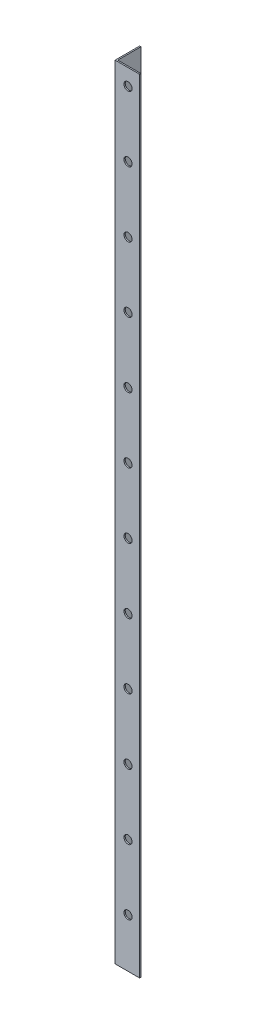
ISO-10303-21;
HEADER;
FILE_DESCRIPTION(('STEP AP214'),'2;1');
FILE_NAME('part.step','',(''),(''),'','','');
FILE_SCHEMA(('AUTOMOTIVE_DESIGN { 1 0 10303 214 1 1 1 1 }'));
ENDSEC;
DATA;
#1=APPLICATION_CONTEXT('core data for automotive mechanical design processes');
#2=APPLICATION_PROTOCOL_DEFINITION('international standard','automotive_design',2000,#1);
#3=PRODUCT_CONTEXT('',#1,'mechanical');
#4=PRODUCT('Part','Part','',(#3));
#5=PRODUCT_RELATED_PRODUCT_CATEGORY('part','',(#4));
#6=PRODUCT_DEFINITION_FORMATION('','',#4);
#7=PRODUCT_DEFINITION_CONTEXT('part definition',#1,'design');
#8=PRODUCT_DEFINITION('design','',#6,#7);
#9=PRODUCT_DEFINITION_SHAPE('','',#8);
#10=(LENGTH_UNIT() NAMED_UNIT(*) SI_UNIT(.MILLI.,.METRE.));
#11=(NAMED_UNIT(*) PLANE_ANGLE_UNIT() SI_UNIT($,.RADIAN.));
#12=(NAMED_UNIT(*) SI_UNIT($,.STERADIAN.) SOLID_ANGLE_UNIT());
#13=UNCERTAINTY_MEASURE_WITH_UNIT(LENGTH_MEASURE(1.E-05),#10,'distance_accuracy_value','');
#14=(GEOMETRIC_REPRESENTATION_CONTEXT(3) GLOBAL_UNCERTAINTY_ASSIGNED_CONTEXT((#13)) GLOBAL_UNIT_ASSIGNED_CONTEXT((#10,
#11,#12)) REPRESENTATION_CONTEXT('',''));
#15=CARTESIAN_POINT('',(0.,0.,0.));
#16=DIRECTION('',(0.,0.,1.));
#17=DIRECTION('',(1.,0.,0.));
#18=AXIS2_PLACEMENT_3D('',#15,#16,#17);
#19=CARTESIAN_POINT('',(0.,6.35000000000002,-5.0165));
#20=DIRECTION('',(1.,0.,0.));
#21=DIRECTION('',(0.,0.,-1.));
#22=AXIS2_PLACEMENT_3D('',#19,#20,#21);
#23=CYLINDRICAL_SURFACE('',#22,1.5875);
#24=CARTESIAN_POINT('',(0.,6.35000000000002,-5.0165));
#25=DIRECTION('',(1.,0.,0.));
#26=DIRECTION('',(0.,0.,-1.));
#27=AXIS2_PLACEMENT_3D('',#24,#25,#26);
#28=CIRCLE('',#27,1.5875);
#29=CARTESIAN_POINT('',(0.,6.35000000000002,-6.604));
#30=VERTEX_POINT('',#29);
#31=EDGE_CURVE('E50',#30,#30,#28,.T.);
#32=ORIENTED_EDGE('',*,*,#31,.F.);
#33=EDGE_LOOP('',(#32));
#34=FACE_BOUND('',#33,.T.);
#35=CARTESIAN_POINT('',(0.508,6.35000000000002,-5.0165));
#36=DIRECTION('',(1.,0.,0.));
#37=DIRECTION('',(0.,0.,-1.));
#38=AXIS2_PLACEMENT_3D('',#35,#36,#37);
#39=CIRCLE('',#38,1.5875);
#40=CARTESIAN_POINT('',(0.508,6.35000000000002,-6.604));
#41=VERTEX_POINT('',#40);
#42=EDGE_CURVE('E11',#41,#41,#39,.T.);
#43=ORIENTED_EDGE('',*,*,#42,.T.);
#44=EDGE_LOOP('',(#43));
#45=FACE_BOUND('',#44,.T.);
#46=ADVANCED_FACE('F39',(#34,#45),#23,.F.);
#47=CARTESIAN_POINT('',(0.,31.75,-5.0165));
#48=DIRECTION('',(1.,0.,0.));
#49=DIRECTION('',(0.,0.,-1.));
#50=AXIS2_PLACEMENT_3D('',#47,#48,#49);
#51=CYLINDRICAL_SURFACE('',#50,1.5875);
#52=CARTESIAN_POINT('',(0.,31.75,-5.0165));
#53=DIRECTION('',(1.,0.,0.));
#54=DIRECTION('',(0.,0.,-1.));
#55=AXIS2_PLACEMENT_3D('',#52,#53,#54);
#56=CIRCLE('',#55,1.5875);
#57=CARTESIAN_POINT('',(0.,31.75,-6.604));
#58=VERTEX_POINT('',#57);
#59=EDGE_CURVE('E255',#58,#58,#56,.T.);
#60=ORIENTED_EDGE('',*,*,#59,.F.);
#61=EDGE_LOOP('',(#60));
#62=FACE_BOUND('',#61,.T.);
#63=CARTESIAN_POINT('',(0.508,31.75,-5.0165));
#64=DIRECTION('',(1.,0.,0.));
#65=DIRECTION('',(0.,0.,-1.));
#66=AXIS2_PLACEMENT_3D('',#63,#64,#65);
#67=CIRCLE('',#66,1.5875);
#68=CARTESIAN_POINT('',(0.508,31.75,-6.604));
#69=VERTEX_POINT('',#68);
#70=EDGE_CURVE('E260',#69,#69,#67,.T.);
#71=ORIENTED_EDGE('',*,*,#70,.T.);
#72=EDGE_LOOP('',(#71));
#73=FACE_BOUND('',#72,.T.);
#74=ADVANCED_FACE('F266',(#62,#73),#51,.F.);
#75=CARTESIAN_POINT('',(0.,57.15,-5.0165));
#76=DIRECTION('',(1.,0.,0.));
#77=DIRECTION('',(0.,0.,-1.));
#78=AXIS2_PLACEMENT_3D('',#75,#76,#77);
#79=CYLINDRICAL_SURFACE('',#78,1.5875);
#80=CARTESIAN_POINT('',(0.,57.15,-5.0165));
#81=DIRECTION('',(1.,0.,0.));
#82=DIRECTION('',(0.,0.,-1.));
#83=AXIS2_PLACEMENT_3D('',#80,#81,#82);
#84=CIRCLE('',#83,1.5875);
#85=CARTESIAN_POINT('',(0.,57.15,-6.604));
#86=VERTEX_POINT('',#85);
#87=EDGE_CURVE('E249',#86,#86,#84,.T.);
#88=ORIENTED_EDGE('',*,*,#87,.F.);
#89=EDGE_LOOP('',(#88));
#90=FACE_BOUND('',#89,.T.);
#91=CARTESIAN_POINT('',(0.508,57.15,-5.0165));
#92=DIRECTION('',(1.,0.,0.));
#93=DIRECTION('',(0.,0.,-1.));
#94=AXIS2_PLACEMENT_3D('',#91,#92,#93);
#95=CIRCLE('',#94,1.5875);
#96=CARTESIAN_POINT('',(0.508,57.15,-6.604));
#97=VERTEX_POINT('',#96);
#98=EDGE_CURVE('E253',#97,#97,#95,.T.);
#99=ORIENTED_EDGE('',*,*,#98,.T.);
#100=EDGE_LOOP('',(#99));
#101=FACE_BOUND('',#100,.T.);
#102=ADVANCED_FACE('F361',(#90,#101),#79,.F.);
#103=CARTESIAN_POINT('',(0.,82.55,-5.0165));
#104=DIRECTION('',(1.,0.,0.));
#105=DIRECTION('',(0.,0.,-1.));
#106=AXIS2_PLACEMENT_3D('',#103,#104,#105);
#107=CYLINDRICAL_SURFACE('',#106,1.5875);
#108=CARTESIAN_POINT('',(0.,82.55,-5.0165));
#109=DIRECTION('',(1.,0.,0.));
#110=DIRECTION('',(0.,0.,-1.));
#111=AXIS2_PLACEMENT_3D('',#108,#109,#110);
#112=CIRCLE('',#111,1.5875);
#113=CARTESIAN_POINT('',(0.,82.55,-6.604));
#114=VERTEX_POINT('',#113);
#115=EDGE_CURVE('E245',#114,#114,#112,.T.);
#116=ORIENTED_EDGE('',*,*,#115,.F.);
#117=EDGE_LOOP('',(#116));
#118=FACE_BOUND('',#117,.T.);
#119=CARTESIAN_POINT('',(0.508,82.55,-5.0165));
#120=DIRECTION('',(1.,0.,0.));
#121=DIRECTION('',(0.,0.,-1.));
#122=AXIS2_PLACEMENT_3D('',#119,#120,#121);
#123=CIRCLE('',#122,1.5875);
#124=CARTESIAN_POINT('',(0.508,82.55,-6.604));
#125=VERTEX_POINT('',#124);
#126=EDGE_CURVE('E243',#125,#125,#123,.T.);
#127=ORIENTED_EDGE('',*,*,#126,.T.);
#128=EDGE_LOOP('',(#127));
#129=FACE_BOUND('',#128,.T.);
#130=ADVANCED_FACE('F358',(#118,#129),#107,.F.);
#131=CARTESIAN_POINT('',(0.,107.95,-5.0165));
#132=DIRECTION('',(1.,0.,0.));
#133=DIRECTION('',(0.,0.,-1.));
#134=AXIS2_PLACEMENT_3D('',#131,#132,#133);
#135=CYLINDRICAL_SURFACE('',#134,1.5875);
#136=CARTESIAN_POINT('',(0.,107.95,-5.0165));
#137=DIRECTION('',(1.,0.,0.));
#138=DIRECTION('',(0.,0.,-1.));
#139=AXIS2_PLACEMENT_3D('',#136,#137,#138);
#140=CIRCLE('',#139,1.5875);
#141=CARTESIAN_POINT('',(0.,107.95,-6.604));
#142=VERTEX_POINT('',#141);
#143=EDGE_CURVE('E237',#142,#142,#140,.T.);
#144=ORIENTED_EDGE('',*,*,#143,.F.);
#145=EDGE_LOOP('',(#144));
#146=FACE_BOUND('',#145,.T.);
#147=CARTESIAN_POINT('',(0.508,107.95,-5.0165));
#148=DIRECTION('',(1.,0.,0.));
#149=DIRECTION('',(0.,0.,-1.));
#150=AXIS2_PLACEMENT_3D('',#147,#148,#149);
#151=CIRCLE('',#150,1.5875);
#152=CARTESIAN_POINT('',(0.508,107.95,-6.604));
#153=VERTEX_POINT('',#152);
#154=EDGE_CURVE('E239',#153,#153,#151,.T.);
#155=ORIENTED_EDGE('',*,*,#154,.T.);
#156=EDGE_LOOP('',(#155));
#157=FACE_BOUND('',#156,.T.);
#158=ADVANCED_FACE('F353',(#146,#157),#135,.F.);
#159=CARTESIAN_POINT('',(0.,133.35,-5.0165));
#160=DIRECTION('',(1.,0.,0.));
#161=DIRECTION('',(0.,0.,-1.));
#162=AXIS2_PLACEMENT_3D('',#159,#160,#161);
#163=CYLINDRICAL_SURFACE('',#162,1.5875);
#164=CARTESIAN_POINT('',(0.,133.35,-5.0165));
#165=DIRECTION('',(1.,0.,0.));
#166=DIRECTION('',(0.,0.,-1.));
#167=AXIS2_PLACEMENT_3D('',#164,#165,#166);
#168=CIRCLE('',#167,1.5875);
#169=CARTESIAN_POINT('',(0.,133.35,-6.604));
#170=VERTEX_POINT('',#169);
#171=EDGE_CURVE('E228',#170,#170,#168,.T.);
#172=ORIENTED_EDGE('',*,*,#171,.F.);
#173=EDGE_LOOP('',(#172));
#174=FACE_BOUND('',#173,.T.);
#175=CARTESIAN_POINT('',(0.508,133.35,-5.0165));
#176=DIRECTION('',(1.,0.,0.));
#177=DIRECTION('',(0.,0.,-1.));
#178=AXIS2_PLACEMENT_3D('',#175,#176,#177);
#179=CIRCLE('',#178,1.5875);
#180=CARTESIAN_POINT('',(0.508,133.35,-6.604));
#181=VERTEX_POINT('',#180);
#182=EDGE_CURVE('E234',#181,#181,#179,.T.);
#183=ORIENTED_EDGE('',*,*,#182,.T.);
#184=EDGE_LOOP('',(#183));
#185=FACE_BOUND('',#184,.T.);
#186=ADVANCED_FACE('F352',(#174,#185),#163,.F.);
#187=CARTESIAN_POINT('',(0.,158.75,-5.0165));
#188=DIRECTION('',(1.,0.,0.));
#189=DIRECTION('',(0.,0.,-1.));
#190=AXIS2_PLACEMENT_3D('',#187,#188,#189);
#191=CYLINDRICAL_SURFACE('',#190,1.5875);
#192=CARTESIAN_POINT('',(0.,158.75,-5.0165));
#193=DIRECTION('',(1.,0.,0.));
#194=DIRECTION('',(0.,0.,-1.));
#195=AXIS2_PLACEMENT_3D('',#192,#193,#194);
#196=CIRCLE('',#195,1.5875);
#197=CARTESIAN_POINT('',(0.,158.75,-6.604));
#198=VERTEX_POINT('',#197);
#199=EDGE_CURVE('E221',#198,#198,#196,.T.);
#200=ORIENTED_EDGE('',*,*,#199,.F.);
#201=EDGE_LOOP('',(#200));
#202=FACE_BOUND('',#201,.T.);
#203=CARTESIAN_POINT('',(0.508,158.75,-5.0165));
#204=DIRECTION('',(1.,0.,0.));
#205=DIRECTION('',(0.,0.,-1.));
#206=AXIS2_PLACEMENT_3D('',#203,#204,#205);
#207=CIRCLE('',#206,1.5875);
#208=CARTESIAN_POINT('',(0.508,158.75,-6.604));
#209=VERTEX_POINT('',#208);
#210=EDGE_CURVE('E230',#209,#209,#207,.T.);
#211=ORIENTED_EDGE('',*,*,#210,.T.);
#212=EDGE_LOOP('',(#211));
#213=FACE_BOUND('',#212,.T.);
#214=ADVANCED_FACE('F350',(#202,#213),#191,.F.);
#215=CARTESIAN_POINT('',(0.,184.15,-5.0165));
#216=DIRECTION('',(1.,0.,0.));
#217=DIRECTION('',(0.,0.,-1.));
#218=AXIS2_PLACEMENT_3D('',#215,#216,#217);
#219=CYLINDRICAL_SURFACE('',#218,1.5875);
#220=CARTESIAN_POINT('',(0.,184.15,-5.0165));
#221=DIRECTION('',(1.,0.,0.));
#222=DIRECTION('',(0.,0.,-1.));
#223=AXIS2_PLACEMENT_3D('',#220,#221,#222);
#224=CIRCLE('',#223,1.5875);
#225=CARTESIAN_POINT('',(0.,184.15,-6.604));
#226=VERTEX_POINT('',#225);
#227=EDGE_CURVE('E217',#226,#226,#224,.T.);
#228=ORIENTED_EDGE('',*,*,#227,.F.);
#229=EDGE_LOOP('',(#228));
#230=FACE_BOUND('',#229,.T.);
#231=CARTESIAN_POINT('',(0.508,184.15,-5.0165));
#232=DIRECTION('',(1.,0.,0.));
#233=DIRECTION('',(0.,0.,-1.));
#234=AXIS2_PLACEMENT_3D('',#231,#232,#233);
#235=CIRCLE('',#234,1.5875);
#236=CARTESIAN_POINT('',(0.508,184.15,-6.604));
#237=VERTEX_POINT('',#236);
#238=EDGE_CURVE('E222',#237,#237,#235,.T.);
#239=ORIENTED_EDGE('',*,*,#238,.T.);
#240=EDGE_LOOP('',(#239));
#241=FACE_BOUND('',#240,.T.);
#242=ADVANCED_FACE('F344',(#230,#241),#219,.F.);
#243=CARTESIAN_POINT('',(0.,209.55,-5.0165));
#244=DIRECTION('',(1.,0.,0.));
#245=DIRECTION('',(0.,0.,-1.));
#246=AXIS2_PLACEMENT_3D('',#243,#244,#245);
#247=CYLINDRICAL_SURFACE('',#246,1.5875);
#248=CARTESIAN_POINT('',(0.,209.55,-5.0165));
#249=DIRECTION('',(1.,0.,0.));
#250=DIRECTION('',(0.,0.,-1.));
#251=AXIS2_PLACEMENT_3D('',#248,#249,#250);
#252=CIRCLE('',#251,1.5875);
#253=CARTESIAN_POINT('',(0.,209.55,-6.604));
#254=VERTEX_POINT('',#253);
#255=EDGE_CURVE('E215',#254,#254,#252,.T.);
#256=ORIENTED_EDGE('',*,*,#255,.F.);
#257=EDGE_LOOP('',(#256));
#258=FACE_BOUND('',#257,.T.);
#259=CARTESIAN_POINT('',(0.508,209.55,-5.0165));
#260=DIRECTION('',(1.,0.,0.));
#261=DIRECTION('',(0.,0.,-1.));
#262=AXIS2_PLACEMENT_3D('',#259,#260,#261);
#263=CIRCLE('',#262,1.5875);
#264=CARTESIAN_POINT('',(0.508,209.55,-6.604));
#265=VERTEX_POINT('',#264);
#266=EDGE_CURVE('E214',#265,#265,#263,.T.);
#267=ORIENTED_EDGE('',*,*,#266,.T.);
#268=EDGE_LOOP('',(#267));
#269=FACE_BOUND('',#268,.T.);
#270=ADVANCED_FACE('F336',(#258,#269),#247,.F.);
#271=CARTESIAN_POINT('',(0.,234.95,-5.0165));
#272=DIRECTION('',(1.,0.,0.));
#273=DIRECTION('',(0.,0.,-1.));
#274=AXIS2_PLACEMENT_3D('',#271,#272,#273);
#275=CYLINDRICAL_SURFACE('',#274,1.5875);
#276=CARTESIAN_POINT('',(0.,234.95,-5.0165));
#277=DIRECTION('',(1.,0.,0.));
#278=DIRECTION('',(0.,0.,-1.));
#279=AXIS2_PLACEMENT_3D('',#276,#277,#278);
#280=CIRCLE('',#279,1.5875);
#281=CARTESIAN_POINT('',(0.,234.95,-6.604));
#282=VERTEX_POINT('',#281);
#283=EDGE_CURVE('E206',#282,#282,#280,.T.);
#284=ORIENTED_EDGE('',*,*,#283,.F.);
#285=EDGE_LOOP('',(#284));
#286=FACE_BOUND('',#285,.T.);
#287=CARTESIAN_POINT('',(0.508,234.95,-5.0165));
#288=DIRECTION('',(1.,0.,0.));
#289=DIRECTION('',(0.,0.,-1.));
#290=AXIS2_PLACEMENT_3D('',#287,#288,#289);
#291=CIRCLE('',#290,1.5875);
#292=CARTESIAN_POINT('',(0.508,234.95,-6.604));
#293=VERTEX_POINT('',#292);
#294=EDGE_CURVE('E207',#293,#293,#291,.T.);
#295=ORIENTED_EDGE('',*,*,#294,.T.);
#296=EDGE_LOOP('',(#295));
#297=FACE_BOUND('',#296,.T.);
#298=ADVANCED_FACE('F333',(#286,#297),#275,.F.);
#299=CARTESIAN_POINT('',(5.0165,19.05,0.));
#300=DIRECTION('',(0.,0.,-1.));
#301=DIRECTION('',(-1.,0.,0.));
#302=AXIS2_PLACEMENT_3D('',#299,#300,#301);
#303=CYLINDRICAL_SURFACE('',#302,1.5875);
#304=CARTESIAN_POINT('',(5.0165,19.05,0.));
#305=DIRECTION('',(0.,0.,-1.));
#306=DIRECTION('',(-1.,0.,0.));
#307=AXIS2_PLACEMENT_3D('',#304,#305,#306);
#308=CIRCLE('',#307,1.5875);
#309=CARTESIAN_POINT('',(3.429,19.05,0.));
#310=VERTEX_POINT('',#309);
#311=EDGE_CURVE('E199',#310,#310,#308,.T.);
#312=ORIENTED_EDGE('',*,*,#311,.F.);
#313=EDGE_LOOP('',(#312));
#314=FACE_BOUND('',#313,.T.);
#315=CARTESIAN_POINT('',(5.0165,19.05,-0.507999999999999));
#316=DIRECTION('',(0.,0.,-1.));
#317=DIRECTION('',(-1.,0.,0.));
#318=AXIS2_PLACEMENT_3D('',#315,#316,#317);
#319=CIRCLE('',#318,1.5875);
#320=CARTESIAN_POINT('',(3.429,19.05,-0.507999999999999));
#321=VERTEX_POINT('',#320);
#322=EDGE_CURVE('E201',#321,#321,#319,.T.);
#323=ORIENTED_EDGE('',*,*,#322,.T.);
#324=EDGE_LOOP('',(#323));
#325=FACE_BOUND('',#324,.T.);
#326=ADVANCED_FACE('F332',(#314,#325),#303,.F.);
#327=CARTESIAN_POINT('',(5.0165,44.45,0.));
#328=DIRECTION('',(0.,0.,-1.));
#329=DIRECTION('',(-1.,0.,0.));
#330=AXIS2_PLACEMENT_3D('',#327,#328,#329);
#331=CYLINDRICAL_SURFACE('',#330,1.5875);
#332=CARTESIAN_POINT('',(5.0165,44.45,0.));
#333=DIRECTION('',(0.,0.,-1.));
#334=DIRECTION('',(-1.,0.,0.));
#335=AXIS2_PLACEMENT_3D('',#332,#333,#334);
#336=CIRCLE('',#335,1.5875);
#337=CARTESIAN_POINT('',(3.429,44.45,0.));
#338=VERTEX_POINT('',#337);
#339=EDGE_CURVE('E193',#338,#338,#336,.T.);
#340=ORIENTED_EDGE('',*,*,#339,.F.);
#341=EDGE_LOOP('',(#340));
#342=FACE_BOUND('',#341,.T.);
#343=CARTESIAN_POINT('',(5.0165,44.45,-0.507999999999999));
#344=DIRECTION('',(0.,0.,-1.));
#345=DIRECTION('',(-1.,0.,0.));
#346=AXIS2_PLACEMENT_3D('',#343,#344,#345);
#347=CIRCLE('',#346,1.5875);
#348=CARTESIAN_POINT('',(3.429,44.45,-0.507999999999999));
#349=VERTEX_POINT('',#348);
#350=EDGE_CURVE('E197',#349,#349,#347,.T.);
#351=ORIENTED_EDGE('',*,*,#350,.T.);
#352=EDGE_LOOP('',(#351));
#353=FACE_BOUND('',#352,.T.);
#354=ADVANCED_FACE('F330',(#342,#353),#331,.F.);
#355=CARTESIAN_POINT('',(5.0165,69.85,0.));
#356=DIRECTION('',(0.,0.,-1.));
#357=DIRECTION('',(-1.,0.,0.));
#358=AXIS2_PLACEMENT_3D('',#355,#356,#357);
#359=CYLINDRICAL_SURFACE('',#358,1.5875);
#360=CARTESIAN_POINT('',(5.0165,69.85,0.));
#361=DIRECTION('',(0.,0.,-1.));
#362=DIRECTION('',(-1.,0.,0.));
#363=AXIS2_PLACEMENT_3D('',#360,#361,#362);
#364=CIRCLE('',#363,1.5875);
#365=CARTESIAN_POINT('',(3.429,69.85,0.));
#366=VERTEX_POINT('',#365);
#367=EDGE_CURVE('E189',#366,#366,#364,.T.);
#368=ORIENTED_EDGE('',*,*,#367,.F.);
#369=EDGE_LOOP('',(#368));
#370=FACE_BOUND('',#369,.T.);
#371=CARTESIAN_POINT('',(5.0165,69.85,-0.507999999999999));
#372=DIRECTION('',(0.,0.,-1.));
#373=DIRECTION('',(-1.,0.,0.));
#374=AXIS2_PLACEMENT_3D('',#371,#372,#373);
#375=CIRCLE('',#374,1.5875);
#376=CARTESIAN_POINT('',(3.429,69.85,-0.507999999999999));
#377=VERTEX_POINT('',#376);
#378=EDGE_CURVE('E191',#377,#377,#375,.T.);
#379=ORIENTED_EDGE('',*,*,#378,.T.);
#380=EDGE_LOOP('',(#379));
#381=FACE_BOUND('',#380,.T.);
#382=ADVANCED_FACE('F323',(#370,#381),#359,.F.);
#383=CARTESIAN_POINT('',(5.0165,95.25,0.));
#384=DIRECTION('',(0.,0.,-1.));
#385=DIRECTION('',(-1.,0.,0.));
#386=AXIS2_PLACEMENT_3D('',#383,#384,#385);
#387=CYLINDRICAL_SURFACE('',#386,1.5875);
#388=CARTESIAN_POINT('',(5.0165,95.25,0.));
#389=DIRECTION('',(0.,0.,-1.));
#390=DIRECTION('',(-1.,0.,0.));
#391=AXIS2_PLACEMENT_3D('',#388,#389,#390);
#392=CIRCLE('',#391,1.5875);
#393=CARTESIAN_POINT('',(3.429,95.25,0.));
#394=VERTEX_POINT('',#393);
#395=EDGE_CURVE('E185',#394,#394,#392,.T.);
#396=ORIENTED_EDGE('',*,*,#395,.F.);
#397=EDGE_LOOP('',(#396));
#398=FACE_BOUND('',#397,.T.);
#399=CARTESIAN_POINT('',(5.0165,95.25,-0.507999999999999));
#400=DIRECTION('',(0.,0.,-1.));
#401=DIRECTION('',(-1.,0.,0.));
#402=AXIS2_PLACEMENT_3D('',#399,#400,#401);
#403=CIRCLE('',#402,1.5875);
#404=CARTESIAN_POINT('',(3.429,95.25,-0.507999999999999));
#405=VERTEX_POINT('',#404);
#406=EDGE_CURVE('E183',#405,#405,#403,.T.);
#407=ORIENTED_EDGE('',*,*,#406,.T.);
#408=EDGE_LOOP('',(#407));
#409=FACE_BOUND('',#408,.T.);
#410=ADVANCED_FACE('F317',(#398,#409),#387,.F.);
#411=CARTESIAN_POINT('',(5.0165,120.65,0.));
#412=DIRECTION('',(0.,0.,-1.));
#413=DIRECTION('',(-1.,0.,0.));
#414=AXIS2_PLACEMENT_3D('',#411,#412,#413);
#415=CYLINDRICAL_SURFACE('',#414,1.5875);
#416=CARTESIAN_POINT('',(5.0165,120.65,0.));
#417=DIRECTION('',(0.,0.,-1.));
#418=DIRECTION('',(-1.,0.,0.));
#419=AXIS2_PLACEMENT_3D('',#416,#417,#418);
#420=CIRCLE('',#419,1.5875);
#421=CARTESIAN_POINT('',(3.429,120.65,0.));
#422=VERTEX_POINT('',#421);
#423=EDGE_CURVE('E176',#422,#422,#420,.T.);
#424=ORIENTED_EDGE('',*,*,#423,.F.);
#425=EDGE_LOOP('',(#424));
#426=FACE_BOUND('',#425,.T.);
#427=CARTESIAN_POINT('',(5.0165,120.65,-0.507999999999999));
#428=DIRECTION('',(0.,0.,-1.));
#429=DIRECTION('',(-1.,0.,0.));
#430=AXIS2_PLACEMENT_3D('',#427,#428,#429);
#431=CIRCLE('',#430,1.5875);
#432=CARTESIAN_POINT('',(3.429,120.65,-0.507999999999999));
#433=VERTEX_POINT('',#432);
#434=EDGE_CURVE('E178',#433,#433,#431,.T.);
#435=ORIENTED_EDGE('',*,*,#434,.T.);
#436=EDGE_LOOP('',(#435));
#437=FACE_BOUND('',#436,.T.);
#438=ADVANCED_FACE('F312',(#426,#437),#415,.F.);
#439=CARTESIAN_POINT('',(5.0165,146.05,0.));
#440=DIRECTION('',(0.,0.,-1.));
#441=DIRECTION('',(-1.,0.,0.));
#442=AXIS2_PLACEMENT_3D('',#439,#440,#441);
#443=CYLINDRICAL_SURFACE('',#442,1.5875);
#444=CARTESIAN_POINT('',(5.0165,146.05,0.));
#445=DIRECTION('',(0.,0.,-1.));
#446=DIRECTION('',(-1.,0.,0.));
#447=AXIS2_PLACEMENT_3D('',#444,#445,#446);
#448=CIRCLE('',#447,1.5875);
#449=CARTESIAN_POINT('',(3.429,146.05,0.));
#450=VERTEX_POINT('',#449);
#451=EDGE_CURVE('E168',#450,#450,#448,.T.);
#452=ORIENTED_EDGE('',*,*,#451,.F.);
#453=EDGE_LOOP('',(#452));
#454=FACE_BOUND('',#453,.T.);
#455=CARTESIAN_POINT('',(5.0165,146.05,-0.507999999999999));
#456=DIRECTION('',(0.,0.,-1.));
#457=DIRECTION('',(-1.,0.,0.));
#458=AXIS2_PLACEMENT_3D('',#455,#456,#457);
#459=CIRCLE('',#458,1.5875);
#460=CARTESIAN_POINT('',(3.429,146.05,-0.507999999999999));
#461=VERTEX_POINT('',#460);
#462=EDGE_CURVE('E174',#461,#461,#459,.T.);
#463=ORIENTED_EDGE('',*,*,#462,.T.);
#464=EDGE_LOOP('',(#463));
#465=FACE_BOUND('',#464,.T.);
#466=ADVANCED_FACE('F313',(#454,#465),#443,.F.);
#467=CARTESIAN_POINT('',(5.0165,171.45,0.));
#468=DIRECTION('',(0.,0.,-1.));
#469=DIRECTION('',(-1.,0.,0.));
#470=AXIS2_PLACEMENT_3D('',#467,#468,#469);
#471=CYLINDRICAL_SURFACE('',#470,1.5875);
#472=CARTESIAN_POINT('',(5.0165,171.45,0.));
#473=DIRECTION('',(0.,0.,-1.));
#474=DIRECTION('',(-1.,0.,0.));
#475=AXIS2_PLACEMENT_3D('',#472,#473,#474);
#476=CIRCLE('',#475,1.5875);
#477=CARTESIAN_POINT('',(3.429,171.45,0.));
#478=VERTEX_POINT('',#477);
#479=EDGE_CURVE('E163',#478,#478,#476,.T.);
#480=ORIENTED_EDGE('',*,*,#479,.F.);
#481=EDGE_LOOP('',(#480));
#482=FACE_BOUND('',#481,.T.);
#483=CARTESIAN_POINT('',(5.0165,171.45,-0.507999999999999));
#484=DIRECTION('',(0.,0.,-1.));
#485=DIRECTION('',(-1.,0.,0.));
#486=AXIS2_PLACEMENT_3D('',#483,#484,#485);
#487=CIRCLE('',#486,1.5875);
#488=CARTESIAN_POINT('',(3.429,171.45,-0.507999999999999));
#489=VERTEX_POINT('',#488);
#490=EDGE_CURVE('E170',#489,#489,#487,.T.);
#491=ORIENTED_EDGE('',*,*,#490,.T.);
#492=EDGE_LOOP('',(#491));
#493=FACE_BOUND('',#492,.T.);
#494=ADVANCED_FACE('F307',(#482,#493),#471,.F.);
#495=CARTESIAN_POINT('',(5.0165,196.85,0.));
#496=DIRECTION('',(0.,0.,-1.));
#497=DIRECTION('',(-1.,0.,0.));
#498=AXIS2_PLACEMENT_3D('',#495,#496,#497);
#499=CYLINDRICAL_SURFACE('',#498,1.5875);
#500=CARTESIAN_POINT('',(5.0165,196.85,0.));
#501=DIRECTION('',(0.,0.,-1.));
#502=DIRECTION('',(-1.,0.,0.));
#503=AXIS2_PLACEMENT_3D('',#500,#501,#502);
#504=CIRCLE('',#503,1.5875);
#505=CARTESIAN_POINT('',(3.429,196.85,0.));
#506=VERTEX_POINT('',#505);
#507=EDGE_CURVE('E158',#506,#506,#504,.T.);
#508=ORIENTED_EDGE('',*,*,#507,.F.);
#509=EDGE_LOOP('',(#508));
#510=FACE_BOUND('',#509,.T.);
#511=CARTESIAN_POINT('',(5.0165,196.85,-0.507999999999999));
#512=DIRECTION('',(0.,0.,-1.));
#513=DIRECTION('',(-1.,0.,0.));
#514=AXIS2_PLACEMENT_3D('',#511,#512,#513);
#515=CIRCLE('',#514,1.5875);
#516=CARTESIAN_POINT('',(3.429,196.85,-0.507999999999999));
#517=VERTEX_POINT('',#516);
#518=EDGE_CURVE('E161',#517,#517,#515,.T.);
#519=ORIENTED_EDGE('',*,*,#518,.T.);
#520=EDGE_LOOP('',(#519));
#521=FACE_BOUND('',#520,.T.);
#522=ADVANCED_FACE('F304',(#510,#521),#499,.F.);
#523=CARTESIAN_POINT('',(5.0165,222.25,0.));
#524=DIRECTION('',(0.,0.,-1.));
#525=DIRECTION('',(-1.,0.,0.));
#526=AXIS2_PLACEMENT_3D('',#523,#524,#525);
#527=CYLINDRICAL_SURFACE('',#526,1.5875);
#528=CARTESIAN_POINT('',(5.0165,222.25,0.));
#529=DIRECTION('',(0.,0.,-1.));
#530=DIRECTION('',(-1.,0.,0.));
#531=AXIS2_PLACEMENT_3D('',#528,#529,#530);
#532=CIRCLE('',#531,1.5875);
#533=CARTESIAN_POINT('',(3.429,222.25,0.));
#534=VERTEX_POINT('',#533);
#535=EDGE_CURVE('E155',#534,#534,#532,.T.);
#536=ORIENTED_EDGE('',*,*,#535,.F.);
#537=EDGE_LOOP('',(#536));
#538=FACE_BOUND('',#537,.T.);
#539=CARTESIAN_POINT('',(5.0165,222.25,-0.507999999999999));
#540=DIRECTION('',(0.,0.,-1.));
#541=DIRECTION('',(-1.,0.,0.));
#542=AXIS2_PLACEMENT_3D('',#539,#540,#541);
#543=CIRCLE('',#542,1.5875);
#544=CARTESIAN_POINT('',(3.429,222.25,-0.507999999999999));
#545=VERTEX_POINT('',#544);
#546=EDGE_CURVE('E154',#545,#545,#543,.T.);
#547=ORIENTED_EDGE('',*,*,#546,.T.);
#548=EDGE_LOOP('',(#547));
#549=FACE_BOUND('',#548,.T.);
#550=ADVANCED_FACE('F296',(#538,#549),#527,.F.);
#551=CARTESIAN_POINT('',(5.0165,247.65,0.));
#552=DIRECTION('',(0.,0.,-1.));
#553=DIRECTION('',(-1.,0.,0.));
#554=AXIS2_PLACEMENT_3D('',#551,#552,#553);
#555=CYLINDRICAL_SURFACE('',#554,1.5875);
#556=CARTESIAN_POINT('',(5.0165,247.65,0.));
#557=DIRECTION('',(0.,0.,-1.));
#558=DIRECTION('',(-1.,0.,0.));
#559=AXIS2_PLACEMENT_3D('',#556,#557,#558);
#560=CIRCLE('',#559,1.5875);
#561=CARTESIAN_POINT('',(3.429,247.65,0.));
#562=VERTEX_POINT('',#561);
#563=EDGE_CURVE('E148',#562,#562,#560,.T.);
#564=ORIENTED_EDGE('',*,*,#563,.F.);
#565=EDGE_LOOP('',(#564));
#566=FACE_BOUND('',#565,.T.);
#567=CARTESIAN_POINT('',(5.0165,247.65,-0.507999999999999));
#568=DIRECTION('',(0.,0.,-1.));
#569=DIRECTION('',(-1.,0.,0.));
#570=AXIS2_PLACEMENT_3D('',#567,#568,#569);
#571=CIRCLE('',#570,1.5875);
#572=CARTESIAN_POINT('',(3.429,247.65,-0.507999999999999));
#573=VERTEX_POINT('',#572);
#574=EDGE_CURVE('E149',#573,#573,#571,.T.);
#575=ORIENTED_EDGE('',*,*,#574,.T.);
#576=EDGE_LOOP('',(#575));
#577=FACE_BOUND('',#576,.T.);
#578=ADVANCED_FACE('F293',(#566,#577),#555,.F.);
#579=CARTESIAN_POINT('',(0.,304.8,-9.525));
#580=DIRECTION('',(1.,0.,0.));
#581=DIRECTION('',(0.,0.,-1.));
#582=AXIS2_PLACEMENT_3D('',#579,#580,#581);
#583=PLANE('',#582);
#584=CARTESIAN_POINT('',(0.,260.35,-5.0165));
#585=DIRECTION('',(1.,0.,0.));
#586=DIRECTION('',(0.,0.,-1.));
#587=AXIS2_PLACEMENT_3D('',#584,#585,#586);
#588=CIRCLE('',#587,1.5875);
#589=CARTESIAN_POINT('',(0.,260.35,-6.604));
#590=VERTEX_POINT('',#589);
#591=EDGE_CURVE('E590',#590,#590,#588,.T.);
#592=ORIENTED_EDGE('',*,*,#591,.T.);
#593=EDGE_LOOP('',(#592));
#594=FACE_BOUND('',#593,.T.);
#595=CARTESIAN_POINT('',(0.,285.75,-5.0165));
#596=DIRECTION('',(1.,0.,0.));
#597=DIRECTION('',(0.,0.,-1.));
#598=AXIS2_PLACEMENT_3D('',#595,#596,#597);
#599=CIRCLE('',#598,1.5875);
#600=CARTESIAN_POINT('',(0.,285.75,-6.604));
#601=VERTEX_POINT('',#600);
#602=EDGE_CURVE('E593',#601,#601,#599,.T.);
#603=ORIENTED_EDGE('',*,*,#602,.T.);
#604=EDGE_LOOP('',(#603));
#605=FACE_BOUND('',#604,.T.);
#606=DIRECTION('',(0.,0.,1.));
#607=VECTOR('',#606,1.);
#608=CARTESIAN_POINT('',(0.,0.,-9.525));
#609=LINE('',#608,#607);
#610=CARTESIAN_POINT('',(0.,0.,-9.525));
#611=VERTEX_POINT('',#610);
#612=CARTESIAN_POINT('',(0.,0.,0.));
#613=VERTEX_POINT('',#612);
#614=EDGE_CURVE('E127',#611,#613,#609,.T.);
#615=ORIENTED_EDGE('',*,*,#614,.T.);
#616=DIRECTION('',(0.,-1.,0.));
#617=VECTOR('',#616,1.);
#618=CARTESIAN_POINT('',(0.,304.8,0.));
#619=LINE('',#618,#617);
#620=CARTESIAN_POINT('',(0.,304.8,0.));
#621=VERTEX_POINT('',#620);
#622=EDGE_CURVE('E145',#621,#613,#619,.T.);
#623=ORIENTED_EDGE('',*,*,#622,.F.);
#624=DIRECTION('',(0.,0.,1.));
#625=VECTOR('',#624,1.);
#626=CARTESIAN_POINT('',(0.,304.8,-9.525));
#627=LINE('',#626,#625);
#628=CARTESIAN_POINT('',(0.,304.8,-9.525));
#629=VERTEX_POINT('',#628);
#630=EDGE_CURVE('E137',#629,#621,#627,.T.);
#631=ORIENTED_EDGE('',*,*,#630,.F.);
#632=DIRECTION('',(0.,-1.,0.));
#633=VECTOR('',#632,1.);
#634=CARTESIAN_POINT('',(0.,304.8,-9.525));
#635=LINE('',#634,#633);
#636=EDGE_CURVE('E122',#629,#611,#635,.T.);
#637=ORIENTED_EDGE('',*,*,#636,.T.);
#638=EDGE_LOOP('',(#615,#623,#631,#637));
#639=FACE_BOUND('',#638,.T.);
#640=ORIENTED_EDGE('',*,*,#283,.T.);
#641=EDGE_LOOP('',(#640));
#642=FACE_BOUND('',#641,.T.);
#643=ORIENTED_EDGE('',*,*,#255,.T.);
#644=EDGE_LOOP('',(#643));
#645=FACE_BOUND('',#644,.T.);
#646=ORIENTED_EDGE('',*,*,#227,.T.);
#647=EDGE_LOOP('',(#646));
#648=FACE_BOUND('',#647,.T.);
#649=ORIENTED_EDGE('',*,*,#199,.T.);
#650=EDGE_LOOP('',(#649));
#651=FACE_BOUND('',#650,.T.);
#652=ORIENTED_EDGE('',*,*,#171,.T.);
#653=EDGE_LOOP('',(#652));
#654=FACE_BOUND('',#653,.T.);
#655=ORIENTED_EDGE('',*,*,#143,.T.);
#656=EDGE_LOOP('',(#655));
#657=FACE_BOUND('',#656,.T.);
#658=ORIENTED_EDGE('',*,*,#115,.T.);
#659=EDGE_LOOP('',(#658));
#660=FACE_BOUND('',#659,.T.);
#661=ORIENTED_EDGE('',*,*,#87,.T.);
#662=EDGE_LOOP('',(#661));
#663=FACE_BOUND('',#662,.T.);
#664=ORIENTED_EDGE('',*,*,#59,.T.);
#665=EDGE_LOOP('',(#664));
#666=FACE_BOUND('',#665,.T.);
#667=ORIENTED_EDGE('',*,*,#31,.T.);
#668=EDGE_LOOP('',(#667));
#669=FACE_BOUND('',#668,.T.);
#670=ADVANCED_FACE('F265',(#594,#605,#639,#642,#645,#648,#651,#654,#657,#660,#663,#666,#669),
#583,.F.);
#671=CARTESIAN_POINT('',(0.,304.8,0.));
#672=DIRECTION('',(0.,0.,-1.));
#673=DIRECTION('',(-1.,0.,0.));
#674=AXIS2_PLACEMENT_3D('',#671,#672,#673);
#675=PLANE('',#674);
#676=CARTESIAN_POINT('',(5.0165,273.05,0.));
#677=DIRECTION('',(0.,0.,-1.));
#678=DIRECTION('',(-1.,0.,0.));
#679=AXIS2_PLACEMENT_3D('',#676,#677,#678);
#680=CIRCLE('',#679,1.5875);
#681=CARTESIAN_POINT('',(3.429,273.05,0.));
#682=VERTEX_POINT('',#681);
#683=EDGE_CURVE('E598',#682,#682,#680,.T.);
#684=ORIENTED_EDGE('',*,*,#683,.T.);
#685=EDGE_LOOP('',(#684));
#686=FACE_BOUND('',#685,.T.);
#687=CARTESIAN_POINT('',(5.0165,298.45,0.));
#688=DIRECTION('',(0.,0.,-1.));
#689=DIRECTION('',(-1.,0.,0.));
#690=AXIS2_PLACEMENT_3D('',#687,#688,#689);
#691=CIRCLE('',#690,1.5875);
#692=CARTESIAN_POINT('',(3.429,298.45,0.));
#693=VERTEX_POINT('',#692);
#694=EDGE_CURVE('E128',#693,#693,#691,.T.);
#695=ORIENTED_EDGE('',*,*,#694,.T.);
#696=EDGE_LOOP('',(#695));
#697=FACE_BOUND('',#696,.T.);
#698=DIRECTION('',(1.,0.,0.));
#699=VECTOR('',#698,1.);
#700=CARTESIAN_POINT('',(0.,0.,0.));
#701=LINE('',#700,#699);
#702=CARTESIAN_POINT('',(9.525,0.,0.));
#703=VERTEX_POINT('',#702);
#704=EDGE_CURVE('E129',#613,#703,#701,.T.);
#705=ORIENTED_EDGE('',*,*,#704,.T.);
#706=DIRECTION('',(0.,-1.,0.));
#707=VECTOR('',#706,1.);
#708=CARTESIAN_POINT('',(9.525,304.8,0.));
#709=LINE('',#708,#707);
#710=CARTESIAN_POINT('',(9.525,304.8,0.));
#711=VERTEX_POINT('',#710);
#712=EDGE_CURVE('E143',#711,#703,#709,.T.);
#713=ORIENTED_EDGE('',*,*,#712,.F.);
#714=DIRECTION('',(1.,0.,0.));
#715=VECTOR('',#714,1.);
#716=CARTESIAN_POINT('',(0.,304.8,0.));
#717=LINE('',#716,#715);
#718=EDGE_CURVE('E91',#621,#711,#717,.T.);
#719=ORIENTED_EDGE('',*,*,#718,.F.);
#720=ORIENTED_EDGE('',*,*,#622,.T.);
#721=EDGE_LOOP('',(#705,#713,#719,#720));
#722=FACE_BOUND('',#721,.T.);
#723=ORIENTED_EDGE('',*,*,#563,.T.);
#724=EDGE_LOOP('',(#723));
#725=FACE_BOUND('',#724,.T.);
#726=ORIENTED_EDGE('',*,*,#535,.T.);
#727=EDGE_LOOP('',(#726));
#728=FACE_BOUND('',#727,.T.);
#729=ORIENTED_EDGE('',*,*,#507,.T.);
#730=EDGE_LOOP('',(#729));
#731=FACE_BOUND('',#730,.T.);
#732=ORIENTED_EDGE('',*,*,#479,.T.);
#733=EDGE_LOOP('',(#732));
#734=FACE_BOUND('',#733,.T.);
#735=ORIENTED_EDGE('',*,*,#451,.T.);
#736=EDGE_LOOP('',(#735));
#737=FACE_BOUND('',#736,.T.);
#738=ORIENTED_EDGE('',*,*,#423,.T.);
#739=EDGE_LOOP('',(#738));
#740=FACE_BOUND('',#739,.T.);
#741=ORIENTED_EDGE('',*,*,#395,.T.);
#742=EDGE_LOOP('',(#741));
#743=FACE_BOUND('',#742,.T.);
#744=ORIENTED_EDGE('',*,*,#367,.T.);
#745=EDGE_LOOP('',(#744));
#746=FACE_BOUND('',#745,.T.);
#747=ORIENTED_EDGE('',*,*,#339,.T.);
#748=EDGE_LOOP('',(#747));
#749=FACE_BOUND('',#748,.T.);
#750=ORIENTED_EDGE('',*,*,#311,.T.);
#751=EDGE_LOOP('',(#750));
#752=FACE_BOUND('',#751,.T.);
#753=ADVANCED_FACE('F288',(#686,#697,#722,#725,#728,#731,#734,#737,#740,#743,#746,#749,#752),
#675,.F.);
#754=CARTESIAN_POINT('',(9.525,304.8,0.));
#755=DIRECTION('',(-1.,0.,0.));
#756=DIRECTION('',(0.,0.,1.));
#757=AXIS2_PLACEMENT_3D('',#754,#755,#756);
#758=PLANE('',#757);
#759=DIRECTION('',(0.,0.,-1.));
#760=VECTOR('',#759,1.);
#761=CARTESIAN_POINT('',(9.525,0.,0.));
#762=LINE('',#761,#760);
#763=CARTESIAN_POINT('',(9.525,0.,-0.508));
#764=VERTEX_POINT('',#763);
#765=EDGE_CURVE('E135',#703,#764,#762,.T.);
#766=ORIENTED_EDGE('',*,*,#765,.T.);
#767=DIRECTION('',(0.,-1.,0.));
#768=VECTOR('',#767,1.);
#769=CARTESIAN_POINT('',(9.525,304.8,-0.508));
#770=LINE('',#769,#768);
#771=CARTESIAN_POINT('',(9.525,304.8,-0.508));
#772=VERTEX_POINT('',#771);
#773=EDGE_CURVE('E117',#772,#764,#770,.T.);
#774=ORIENTED_EDGE('',*,*,#773,.F.);
#775=DIRECTION('',(0.,0.,-1.));
#776=VECTOR('',#775,1.);
#777=CARTESIAN_POINT('',(9.525,304.8,0.));
#778=LINE('',#777,#776);
#779=EDGE_CURVE('E106',#711,#772,#778,.T.);
#780=ORIENTED_EDGE('',*,*,#779,.F.);
#781=ORIENTED_EDGE('',*,*,#712,.T.);
#782=EDGE_LOOP('',(#766,#774,#780,#781));
#783=FACE_BOUND('',#782,.T.);
#784=ADVANCED_FACE('F278',(#783),#758,.F.);
#785=CARTESIAN_POINT('',(9.525,304.8,-0.508));
#786=DIRECTION('',(0.,0.,1.));
#787=DIRECTION('',(1.,0.,0.));
#788=AXIS2_PLACEMENT_3D('',#785,#786,#787);
#789=PLANE('',#788);
#790=CARTESIAN_POINT('',(5.0165,273.05,-0.507999999999999));
#791=DIRECTION('',(0.,0.,-1.));
#792=DIRECTION('',(-1.,0.,0.));
#793=AXIS2_PLACEMENT_3D('',#790,#791,#792);
#794=CIRCLE('',#793,1.5875);
#795=CARTESIAN_POINT('',(3.429,273.05,-0.507999999999999));
#796=VERTEX_POINT('',#795);
#797=EDGE_CURVE('E605',#796,#796,#794,.T.);
#798=ORIENTED_EDGE('',*,*,#797,.F.);
#799=EDGE_LOOP('',(#798));
#800=FACE_BOUND('',#799,.T.);
#801=CARTESIAN_POINT('',(5.0165,298.45,-0.507999999999999));
#802=DIRECTION('',(0.,0.,-1.));
#803=DIRECTION('',(-1.,0.,0.));
#804=AXIS2_PLACEMENT_3D('',#801,#802,#803);
#805=CIRCLE('',#804,1.5875);
#806=CARTESIAN_POINT('',(3.429,298.45,-0.507999999999999));
#807=VERTEX_POINT('',#806);
#808=EDGE_CURVE('E604',#807,#807,#805,.T.);
#809=ORIENTED_EDGE('',*,*,#808,.F.);
#810=EDGE_LOOP('',(#809));
#811=FACE_BOUND('',#810,.T.);
#812=DIRECTION('',(-1.,0.,0.));
#813=VECTOR('',#812,1.);
#814=CARTESIAN_POINT('',(9.525,0.,-0.508));
#815=LINE('',#814,#813);
#816=CARTESIAN_POINT('',(0.508,0.,-0.507999999999999));
#817=VERTEX_POINT('',#816);
#818=EDGE_CURVE('E113',#764,#817,#815,.T.);
#819=ORIENTED_EDGE('',*,*,#818,.T.);
#820=DIRECTION('',(0.,-1.,0.));
#821=VECTOR('',#820,1.);
#822=CARTESIAN_POINT('',(0.508,304.8,-0.507999999999999));
#823=LINE('',#822,#821);
#824=CARTESIAN_POINT('',(0.508,304.8,-0.507999999999999));
#825=VERTEX_POINT('',#824);
#826=EDGE_CURVE('E112',#825,#817,#823,.T.);
#827=ORIENTED_EDGE('',*,*,#826,.F.);
#828=DIRECTION('',(-1.,0.,0.));
#829=VECTOR('',#828,1.);
#830=CARTESIAN_POINT('',(9.525,304.8,-0.508));
#831=LINE('',#830,#829);
#832=EDGE_CURVE('E99',#772,#825,#831,.T.);
#833=ORIENTED_EDGE('',*,*,#832,.F.);
#834=ORIENTED_EDGE('',*,*,#773,.T.);
#835=EDGE_LOOP('',(#819,#827,#833,#834));
#836=FACE_BOUND('',#835,.T.);
#837=ORIENTED_EDGE('',*,*,#574,.F.);
#838=EDGE_LOOP('',(#837));
#839=FACE_BOUND('',#838,.T.);
#840=ORIENTED_EDGE('',*,*,#546,.F.);
#841=EDGE_LOOP('',(#840));
#842=FACE_BOUND('',#841,.T.);
#843=ORIENTED_EDGE('',*,*,#518,.F.);
#844=EDGE_LOOP('',(#843));
#845=FACE_BOUND('',#844,.T.);
#846=ORIENTED_EDGE('',*,*,#490,.F.);
#847=EDGE_LOOP('',(#846));
#848=FACE_BOUND('',#847,.T.);
#849=ORIENTED_EDGE('',*,*,#462,.F.);
#850=EDGE_LOOP('',(#849));
#851=FACE_BOUND('',#850,.T.);
#852=ORIENTED_EDGE('',*,*,#434,.F.);
#853=EDGE_LOOP('',(#852));
#854=FACE_BOUND('',#853,.T.);
#855=ORIENTED_EDGE('',*,*,#406,.F.);
#856=EDGE_LOOP('',(#855));
#857=FACE_BOUND('',#856,.T.);
#858=ORIENTED_EDGE('',*,*,#378,.F.);
#859=EDGE_LOOP('',(#858));
#860=FACE_BOUND('',#859,.T.);
#861=ORIENTED_EDGE('',*,*,#350,.F.);
#862=EDGE_LOOP('',(#861));
#863=FACE_BOUND('',#862,.T.);
#864=ORIENTED_EDGE('',*,*,#322,.F.);
#865=EDGE_LOOP('',(#864));
#866=FACE_BOUND('',#865,.T.);
#867=ADVANCED_FACE('F115',(#800,#811,#836,#839,#842,#845,#848,#851,#854,#857,#860,#863,#866),
#789,.F.);
#868=CARTESIAN_POINT('',(0.508,304.8,-0.507999999999999));
#869=DIRECTION('',(-1.,0.,0.));
#870=DIRECTION('',(0.,0.,1.));
#871=AXIS2_PLACEMENT_3D('',#868,#869,#870);
#872=PLANE('',#871);
#873=CARTESIAN_POINT('',(0.508,260.35,-5.0165));
#874=DIRECTION('',(1.,0.,0.));
#875=DIRECTION('',(0.,0.,-1.));
#876=AXIS2_PLACEMENT_3D('',#873,#874,#875);
#877=CIRCLE('',#876,1.5875);
#878=CARTESIAN_POINT('',(0.508,260.35,-6.604));
#879=VERTEX_POINT('',#878);
#880=EDGE_CURVE('E589',#879,#879,#877,.T.);
#881=ORIENTED_EDGE('',*,*,#880,.F.);
#882=EDGE_LOOP('',(#881));
#883=FACE_BOUND('',#882,.T.);
#884=CARTESIAN_POINT('',(0.508,285.75,-5.0165));
#885=DIRECTION('',(1.,0.,0.));
#886=DIRECTION('',(0.,0.,-1.));
#887=AXIS2_PLACEMENT_3D('',#884,#885,#886);
#888=CIRCLE('',#887,1.5875);
#889=CARTESIAN_POINT('',(0.508,285.75,-6.604));
#890=VERTEX_POINT('',#889);
#891=EDGE_CURVE('E587',#890,#890,#888,.T.);
#892=ORIENTED_EDGE('',*,*,#891,.F.);
#893=EDGE_LOOP('',(#892));
#894=FACE_BOUND('',#893,.T.);
#895=DIRECTION('',(0.,0.,-1.));
#896=VECTOR('',#895,1.);
#897=CARTESIAN_POINT('',(0.508,0.,-0.507999999999999));
#898=LINE('',#897,#896);
#899=CARTESIAN_POINT('',(0.508,0.,-9.525));
#900=VERTEX_POINT('',#899);
#901=EDGE_CURVE('E79',#817,#900,#898,.T.);
#902=ORIENTED_EDGE('',*,*,#901,.T.);
#903=DIRECTION('',(0.,-1.,0.));
#904=VECTOR('',#903,1.);
#905=CARTESIAN_POINT('',(0.508,304.8,-9.525));
#906=LINE('',#905,#904);
#907=CARTESIAN_POINT('',(0.508,304.8,-9.525));
#908=VERTEX_POINT('',#907);
#909=EDGE_CURVE('E120',#908,#900,#906,.T.);
#910=ORIENTED_EDGE('',*,*,#909,.F.);
#911=DIRECTION('',(0.,0.,-1.));
#912=VECTOR('',#911,1.);
#913=CARTESIAN_POINT('',(0.508,304.8,-0.507999999999999));
#914=LINE('',#913,#912);
#915=EDGE_CURVE('E102',#825,#908,#914,.T.);
#916=ORIENTED_EDGE('',*,*,#915,.F.);
#917=ORIENTED_EDGE('',*,*,#826,.T.);
#918=EDGE_LOOP('',(#902,#910,#916,#917));
#919=FACE_BOUND('',#918,.T.);
#920=ORIENTED_EDGE('',*,*,#294,.F.);
#921=EDGE_LOOP('',(#920));
#922=FACE_BOUND('',#921,.T.);
#923=ORIENTED_EDGE('',*,*,#266,.F.);
#924=EDGE_LOOP('',(#923));
#925=FACE_BOUND('',#924,.T.);
#926=ORIENTED_EDGE('',*,*,#238,.F.);
#927=EDGE_LOOP('',(#926));
#928=FACE_BOUND('',#927,.T.);
#929=ORIENTED_EDGE('',*,*,#210,.F.);
#930=EDGE_LOOP('',(#929));
#931=FACE_BOUND('',#930,.T.);
#932=ORIENTED_EDGE('',*,*,#182,.F.);
#933=EDGE_LOOP('',(#932));
#934=FACE_BOUND('',#933,.T.);
#935=ORIENTED_EDGE('',*,*,#154,.F.);
#936=EDGE_LOOP('',(#935));
#937=FACE_BOUND('',#936,.T.);
#938=ORIENTED_EDGE('',*,*,#126,.F.);
#939=EDGE_LOOP('',(#938));
#940=FACE_BOUND('',#939,.T.);
#941=ORIENTED_EDGE('',*,*,#98,.F.);
#942=EDGE_LOOP('',(#941));
#943=FACE_BOUND('',#942,.T.);
#944=ORIENTED_EDGE('',*,*,#70,.F.);
#945=EDGE_LOOP('',(#944));
#946=FACE_BOUND('',#945,.T.);
#947=ORIENTED_EDGE('',*,*,#42,.F.);
#948=EDGE_LOOP('',(#947));
#949=FACE_BOUND('',#948,.T.);
#950=ADVANCED_FACE('F116',(#883,#894,#919,#922,#925,#928,#931,#934,#937,#940,#943,#946,#949),
#872,.F.);
#951=CARTESIAN_POINT('',(0.508,304.8,-9.525));
#952=DIRECTION('',(0.,0.,1.));
#953=DIRECTION('',(1.,0.,0.));
#954=AXIS2_PLACEMENT_3D('',#951,#952,#953);
#955=PLANE('',#954);
#956=DIRECTION('',(-1.,0.,0.));
#957=VECTOR('',#956,1.);
#958=CARTESIAN_POINT('',(0.508,0.,-9.525));
#959=LINE('',#958,#957);
#960=EDGE_CURVE('E83',#900,#611,#959,.T.);
#961=ORIENTED_EDGE('',*,*,#960,.T.);
#962=ORIENTED_EDGE('',*,*,#636,.F.);
#963=DIRECTION('',(-1.,0.,0.));
#964=VECTOR('',#963,1.);
#965=CARTESIAN_POINT('',(0.508,304.8,-9.525));
#966=LINE('',#965,#964);
#967=EDGE_CURVE('E54',#908,#629,#966,.T.);
#968=ORIENTED_EDGE('',*,*,#967,.F.);
#969=ORIENTED_EDGE('',*,*,#909,.T.);
#970=EDGE_LOOP('',(#961,#962,#968,#969));
#971=FACE_BOUND('',#970,.T.);
#972=ADVANCED_FACE('F269',(#971),#955,.F.);
#973=CARTESIAN_POINT('',(0.,304.8,0.));
#974=DIRECTION('',(0.,1.,0.));
#975=DIRECTION('',(0.,0.,1.));
#976=AXIS2_PLACEMENT_3D('',#973,#974,#975);
#977=PLANE('',#976);
#978=ORIENTED_EDGE('',*,*,#630,.T.);
#979=ORIENTED_EDGE('',*,*,#718,.T.);
#980=ORIENTED_EDGE('',*,*,#779,.T.);
#981=ORIENTED_EDGE('',*,*,#832,.T.);
#982=ORIENTED_EDGE('',*,*,#915,.T.);
#983=ORIENTED_EDGE('',*,*,#967,.T.);
#984=EDGE_LOOP('',(#978,#979,#980,#981,#982,#983));
#985=FACE_BOUND('',#984,.T.);
#986=ADVANCED_FACE('F105',(#985),#977,.T.);
#987=CARTESIAN_POINT('',(0.,0.,0.));
#988=DIRECTION('',(0.,1.,0.));
#989=DIRECTION('',(0.,0.,1.));
#990=AXIS2_PLACEMENT_3D('',#987,#988,#989);
#991=PLANE('',#990);
#992=ORIENTED_EDGE('',*,*,#614,.F.);
#993=ORIENTED_EDGE('',*,*,#960,.F.);
#994=ORIENTED_EDGE('',*,*,#901,.F.);
#995=ORIENTED_EDGE('',*,*,#818,.F.);
#996=ORIENTED_EDGE('',*,*,#765,.F.);
#997=ORIENTED_EDGE('',*,*,#704,.F.);
#998=EDGE_LOOP('',(#992,#993,#994,#995,#996,#997));
#999=FACE_BOUND('',#998,.T.);
#1000=ADVANCED_FACE('F461',(#999),#991,.F.);
#1001=CARTESIAN_POINT('',(5.0165,298.45,0.));
#1002=DIRECTION('',(0.,0.,-1.));
#1003=DIRECTION('',(-1.,0.,0.));
#1004=AXIS2_PLACEMENT_3D('',#1001,#1002,#1003);
#1005=CYLINDRICAL_SURFACE('',#1004,1.5875);
#1006=ORIENTED_EDGE('',*,*,#694,.F.);
#1007=EDGE_LOOP('',(#1006));
#1008=FACE_BOUND('',#1007,.T.);
#1009=ORIENTED_EDGE('',*,*,#808,.T.);
#1010=EDGE_LOOP('',(#1009));
#1011=FACE_BOUND('',#1010,.T.);
#1012=ADVANCED_FACE('F471',(#1008,#1011),#1005,.F.);
#1013=CARTESIAN_POINT('',(5.0165,273.05,0.));
#1014=DIRECTION('',(0.,0.,-1.));
#1015=DIRECTION('',(-1.,0.,0.));
#1016=AXIS2_PLACEMENT_3D('',#1013,#1014,#1015);
#1017=CYLINDRICAL_SURFACE('',#1016,1.5875);
#1018=ORIENTED_EDGE('',*,*,#683,.F.);
#1019=EDGE_LOOP('',(#1018));
#1020=FACE_BOUND('',#1019,.T.);
#1021=ORIENTED_EDGE('',*,*,#797,.T.);
#1022=EDGE_LOOP('',(#1021));
#1023=FACE_BOUND('',#1022,.T.);
#1024=ADVANCED_FACE('F485',(#1020,#1023),#1017,.F.);
#1025=CARTESIAN_POINT('',(0.,285.75,-5.0165));
#1026=DIRECTION('',(1.,0.,0.));
#1027=DIRECTION('',(0.,0.,-1.));
#1028=AXIS2_PLACEMENT_3D('',#1025,#1026,#1027);
#1029=CYLINDRICAL_SURFACE('',#1028,1.5875);
#1030=ORIENTED_EDGE('',*,*,#602,.F.);
#1031=EDGE_LOOP('',(#1030));
#1032=FACE_BOUND('',#1031,.T.);
#1033=ORIENTED_EDGE('',*,*,#891,.T.);
#1034=EDGE_LOOP('',(#1033));
#1035=FACE_BOUND('',#1034,.T.);
#1036=ADVANCED_FACE('F555',(#1032,#1035),#1029,.F.);
#1037=CARTESIAN_POINT('',(0.,260.35,-5.0165));
#1038=DIRECTION('',(1.,0.,0.));
#1039=DIRECTION('',(0.,0.,-1.));
#1040=AXIS2_PLACEMENT_3D('',#1037,#1038,#1039);
#1041=CYLINDRICAL_SURFACE('',#1040,1.5875);
#1042=ORIENTED_EDGE('',*,*,#591,.F.);
#1043=EDGE_LOOP('',(#1042));
#1044=FACE_BOUND('',#1043,.T.);
#1045=ORIENTED_EDGE('',*,*,#880,.T.);
#1046=EDGE_LOOP('',(#1045));
#1047=FACE_BOUND('',#1046,.T.);
#1048=ADVANCED_FACE('F556',(#1044,#1047),#1041,.F.);
#1049=CLOSED_SHELL('',(#46,#74,#102,#130,#158,#186,#214,#242,#270,#298,#326,#354,#382,#410,#438,
#466,#494,#522,#550,#578,#670,#753,#784,#867,#950,#972,#986,#1000,#1012,#1024,#1036,#1048));
#1050=MANIFOLD_SOLID_BREP('B2',#1049);
#1051=ADVANCED_BREP_SHAPE_REPRESENTATION('',(#18,#1050),#14);
#1052=SHAPE_DEFINITION_REPRESENTATION(#9,#1051);
ENDSEC;
END-ISO-10303-21;
